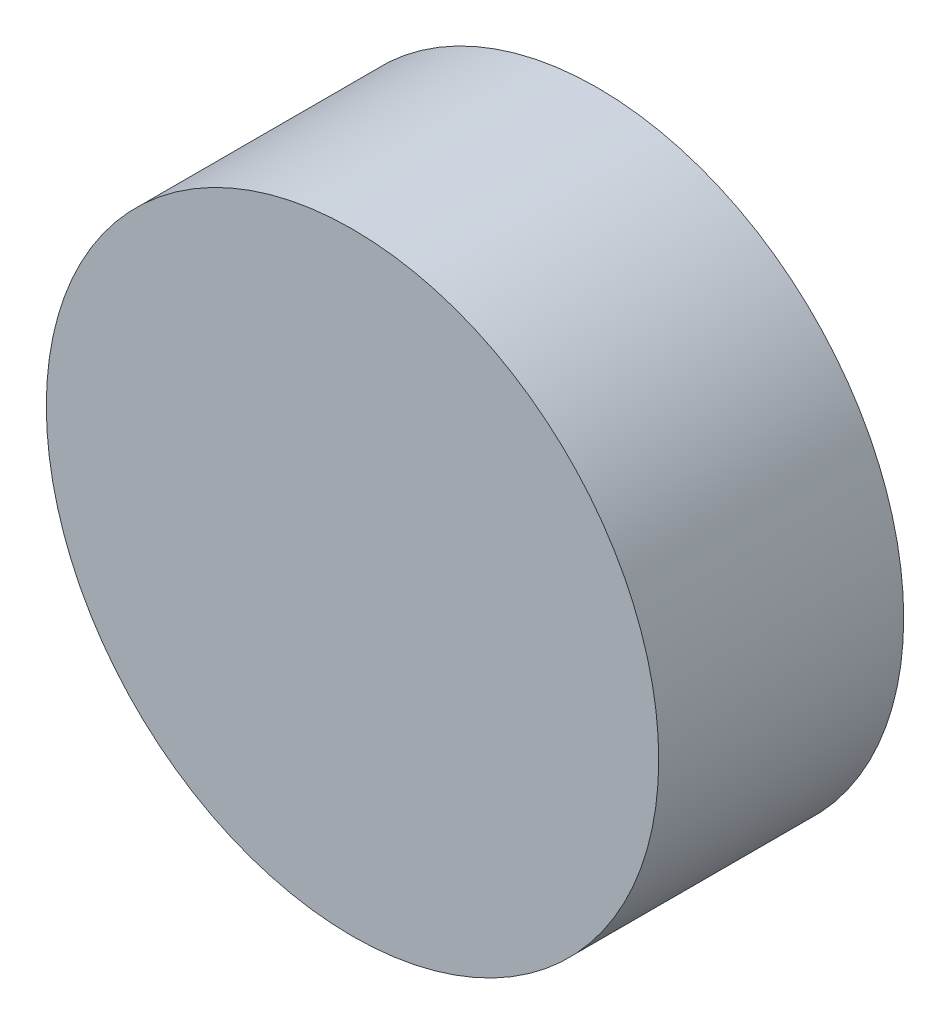
ISO-10303-21;
HEADER;
FILE_DESCRIPTION(('STEP AP214'),'2;1');
FILE_NAME('part.step','',(''),(''),'','','');
FILE_SCHEMA(('AUTOMOTIVE_DESIGN { 1 0 10303 214 1 1 1 1 }'));
ENDSEC;
DATA;
#1=APPLICATION_CONTEXT('core data for automotive mechanical design processes');
#2=APPLICATION_PROTOCOL_DEFINITION('international standard','automotive_design',2000,#1);
#3=PRODUCT_CONTEXT('',#1,'mechanical');
#4=PRODUCT('Part','Part','',(#3));
#5=PRODUCT_RELATED_PRODUCT_CATEGORY('part','',(#4));
#6=PRODUCT_DEFINITION_FORMATION('','',#4);
#7=PRODUCT_DEFINITION_CONTEXT('part definition',#1,'design');
#8=PRODUCT_DEFINITION('design','',#6,#7);
#9=PRODUCT_DEFINITION_SHAPE('','',#8);
#10=(LENGTH_UNIT() NAMED_UNIT(*) SI_UNIT(.MILLI.,.METRE.));
#11=(NAMED_UNIT(*) PLANE_ANGLE_UNIT() SI_UNIT($,.RADIAN.));
#12=(NAMED_UNIT(*) SI_UNIT($,.STERADIAN.) SOLID_ANGLE_UNIT());
#13=UNCERTAINTY_MEASURE_WITH_UNIT(LENGTH_MEASURE(1.E-05),#10,'distance_accuracy_value','');
#14=(GEOMETRIC_REPRESENTATION_CONTEXT(3) GLOBAL_UNCERTAINTY_ASSIGNED_CONTEXT((#13)) GLOBAL_UNIT_ASSIGNED_CONTEXT((#10,
#11,#12)) REPRESENTATION_CONTEXT('',''));
#15=CARTESIAN_POINT('',(0.,0.,0.));
#16=DIRECTION('',(0.,0.,1.));
#17=DIRECTION('',(1.,0.,0.));
#18=AXIS2_PLACEMENT_3D('',#15,#16,#17);
#19=CARTESIAN_POINT('',(0.,0.,40.));
#20=DIRECTION('',(0.,0.,-1.));
#21=DIRECTION('',(-1.,0.,0.));
#22=AXIS2_PLACEMENT_3D('',#19,#20,#21);
#23=CYLINDRICAL_SURFACE('',#22,50.);
#24=CARTESIAN_POINT('',(0.,0.,40.));
#25=DIRECTION('',(0.,0.,1.));
#26=DIRECTION('',(1.,0.,0.));
#27=AXIS2_PLACEMENT_3D('',#24,#25,#26);
#28=CIRCLE('',#27,50.);
#29=CARTESIAN_POINT('',(50.,0.,40.));
#30=VERTEX_POINT('',#29);
#31=EDGE_CURVE('E10',#30,#30,#28,.T.);
#32=ORIENTED_EDGE('',*,*,#31,.F.);
#33=EDGE_LOOP('',(#32));
#34=FACE_BOUND('',#33,.T.);
#35=CARTESIAN_POINT('',(0.,0.,0.));
#36=DIRECTION('',(0.,0.,1.));
#37=DIRECTION('',(1.,0.,0.));
#38=AXIS2_PLACEMENT_3D('',#35,#36,#37);
#39=CIRCLE('',#38,50.);
#40=CARTESIAN_POINT('',(50.,0.,0.));
#41=VERTEX_POINT('',#40);
#42=EDGE_CURVE('E34',#41,#41,#39,.T.);
#43=ORIENTED_EDGE('',*,*,#42,.T.);
#44=EDGE_LOOP('',(#43));
#45=FACE_BOUND('',#44,.T.);
#46=ADVANCED_FACE('F31',(#34,#45),#23,.T.);
#47=CARTESIAN_POINT('',(0.,0.,40.));
#48=DIRECTION('',(0.,0.,1.));
#49=DIRECTION('',(1.,0.,0.));
#50=AXIS2_PLACEMENT_3D('',#47,#48,#49);
#51=PLANE('',#50);
#52=ORIENTED_EDGE('',*,*,#31,.T.);
#53=EDGE_LOOP('',(#52));
#54=FACE_BOUND('',#53,.T.);
#55=ADVANCED_FACE('F83',(#54),#51,.T.);
#56=CARTESIAN_POINT('',(0.,0.,0.));
#57=DIRECTION('',(0.,0.,1.));
#58=DIRECTION('',(1.,0.,0.));
#59=AXIS2_PLACEMENT_3D('',#56,#57,#58);
#60=PLANE('',#59);
#61=CARTESIAN_POINT('',(0.,0.,0.));
#62=DIRECTION('',(0.,0.,-1.));
#63=DIRECTION('',(-1.,0.,0.));
#64=AXIS2_PLACEMENT_3D('',#61,#62,#63);
#65=CIRCLE('',#64,45.);
#66=CARTESIAN_POINT('',(-45.,0.,0.));
#67=VERTEX_POINT('',#66);
#68=EDGE_CURVE('E43',#67,#67,#65,.T.);
#69=ORIENTED_EDGE('',*,*,#68,.F.);
#70=EDGE_LOOP('',(#69));
#71=FACE_BOUND('',#70,.T.);
#72=ORIENTED_EDGE('',*,*,#42,.F.);
#73=EDGE_LOOP('',(#72));
#74=FACE_BOUND('',#73,.T.);
#75=ADVANCED_FACE('F88',(#71,#74),#60,.F.);
#76=CARTESIAN_POINT('',(0.,0.,1.5));
#77=DIRECTION('',(0.,0.,-1.));
#78=DIRECTION('',(-1.,0.,0.));
#79=AXIS2_PLACEMENT_3D('',#76,#77,#78);
#80=CYLINDRICAL_SURFACE('',#79,45.);
#81=CARTESIAN_POINT('',(0.,0.,1.5));
#82=DIRECTION('',(0.,0.,-1.));
#83=DIRECTION('',(-1.,0.,0.));
#84=AXIS2_PLACEMENT_3D('',#81,#82,#83);
#85=CIRCLE('',#84,45.);
#86=CARTESIAN_POINT('',(-45.,0.,1.5));
#87=VERTEX_POINT('',#86);
#88=EDGE_CURVE('E41',#87,#87,#85,.T.);
#89=ORIENTED_EDGE('',*,*,#88,.F.);
#90=EDGE_LOOP('',(#89));
#91=FACE_BOUND('',#90,.T.);
#92=ORIENTED_EDGE('',*,*,#68,.T.);
#93=EDGE_LOOP('',(#92));
#94=FACE_BOUND('',#93,.T.);
#95=ADVANCED_FACE('F94',(#91,#94),#80,.F.);
#96=CARTESIAN_POINT('',(0.,0.,1.5));
#97=DIRECTION('',(0.,0.,-1.));
#98=DIRECTION('',(-1.,0.,0.));
#99=AXIS2_PLACEMENT_3D('',#96,#97,#98);
#100=PLANE('',#99);
#101=CARTESIAN_POINT('',(0.,0.,1.5));
#102=DIRECTION('',(0.,0.,-1.));
#103=DIRECTION('',(-1.,0.,0.));
#104=AXIS2_PLACEMENT_3D('',#101,#102,#103);
#105=CIRCLE('',#104,32.5);
#106=CARTESIAN_POINT('',(-32.5,0.,1.5));
#107=VERTEX_POINT('',#106);
#108=EDGE_CURVE('E46',#107,#107,#105,.T.);
#109=ORIENTED_EDGE('',*,*,#108,.F.);
#110=EDGE_LOOP('',(#109));
#111=FACE_BOUND('',#110,.T.);
#112=ORIENTED_EDGE('',*,*,#88,.T.);
#113=EDGE_LOOP('',(#112));
#114=FACE_BOUND('',#113,.T.);
#115=ADVANCED_FACE('F100',(#111,#114),#100,.T.);
#116=CARTESIAN_POINT('',(0.,0.,1.5));
#117=DIRECTION('',(0.,0.,-1.));
#118=DIRECTION('',(-1.,0.,0.));
#119=AXIS2_PLACEMENT_3D('',#116,#117,#118);
#120=CYLINDRICAL_SURFACE('',#119,32.5);
#121=ORIENTED_EDGE('',*,*,#108,.T.);
#122=EDGE_LOOP('',(#121));
#123=FACE_BOUND('',#122,.T.);
#124=CARTESIAN_POINT('',(0.,0.,0.));
#125=DIRECTION('',(0.,0.,-1.));
#126=DIRECTION('',(-1.,0.,0.));
#127=AXIS2_PLACEMENT_3D('',#124,#125,#126);
#128=CIRCLE('',#127,32.5);
#129=CARTESIAN_POINT('',(-32.5,0.,0.));
#130=VERTEX_POINT('',#129);
#131=EDGE_CURVE('E49',#130,#130,#128,.T.);
#132=ORIENTED_EDGE('',*,*,#131,.F.);
#133=EDGE_LOOP('',(#132));
#134=FACE_BOUND('',#133,.T.);
#135=ADVANCED_FACE('F105',(#123,#134),#120,.T.);
#136=CARTESIAN_POINT('',(0.,0.,0.));
#137=DIRECTION('',(0.,0.,-1.));
#138=DIRECTION('',(-1.,0.,0.));
#139=AXIS2_PLACEMENT_3D('',#136,#137,#138);
#140=CIRCLE('',#139,13.);
#141=CARTESIAN_POINT('',(-13.,0.,0.));
#142=VERTEX_POINT('',#141);
#143=EDGE_CURVE('E55',#142,#142,#140,.T.);
#144=ORIENTED_EDGE('',*,*,#143,.F.);
#145=EDGE_LOOP('',(#144));
#146=FACE_BOUND('',#145,.T.);
#147=ORIENTED_EDGE('',*,*,#131,.T.);
#148=EDGE_LOOP('',(#147));
#149=FACE_BOUND('',#148,.T.);
#150=ADVANCED_FACE('F96',(#146,#149),#60,.F.);
#151=CARTESIAN_POINT('',(0.,0.,8.));
#152=DIRECTION('',(0.,0.,-1.));
#153=DIRECTION('',(-1.,0.,0.));
#154=AXIS2_PLACEMENT_3D('',#151,#152,#153);
#155=CYLINDRICAL_SURFACE('',#154,13.);
#156=CARTESIAN_POINT('',(0.,0.,8.));
#157=DIRECTION('',(0.,0.,-1.));
#158=DIRECTION('',(-1.,0.,0.));
#159=AXIS2_PLACEMENT_3D('',#156,#157,#158);
#160=CIRCLE('',#159,13.);
#161=CARTESIAN_POINT('',(-13.,0.,8.));
#162=VERTEX_POINT('',#161);
#163=EDGE_CURVE('E52',#162,#162,#160,.T.);
#164=ORIENTED_EDGE('',*,*,#163,.F.);
#165=EDGE_LOOP('',(#164));
#166=FACE_BOUND('',#165,.T.);
#167=ORIENTED_EDGE('',*,*,#143,.T.);
#168=EDGE_LOOP('',(#167));
#169=FACE_BOUND('',#168,.T.);
#170=ADVANCED_FACE('F79',(#166,#169),#155,.F.);
#171=CARTESIAN_POINT('',(0.,0.,8.));
#172=DIRECTION('',(0.,0.,-1.));
#173=DIRECTION('',(-1.,0.,0.));
#174=AXIS2_PLACEMENT_3D('',#171,#172,#173);
#175=PLANE('',#174);
#176=CARTESIAN_POINT('',(0.,0.,8.));
#177=DIRECTION('',(0.,0.,-1.));
#178=DIRECTION('',(-1.,0.,0.));
#179=AXIS2_PLACEMENT_3D('',#176,#177,#178);
#180=CIRCLE('',#179,5.00000000000002);
#181=CARTESIAN_POINT('',(-5.00000000000002,0.,8.));
#182=VERTEX_POINT('',#181);
#183=EDGE_CURVE('E58',#182,#182,#180,.T.);
#184=ORIENTED_EDGE('',*,*,#183,.F.);
#185=EDGE_LOOP('',(#184));
#186=FACE_BOUND('',#185,.T.);
#187=ORIENTED_EDGE('',*,*,#163,.T.);
#188=EDGE_LOOP('',(#187));
#189=FACE_BOUND('',#188,.T.);
#190=ADVANCED_FACE('F71',(#186,#189),#175,.T.);
#191=CARTESIAN_POINT('',(0.,0.,10.));
#192=DIRECTION('',(0.,0.,-1.));
#193=DIRECTION('',(-1.,0.,0.));
#194=AXIS2_PLACEMENT_3D('',#191,#192,#193);
#195=CYLINDRICAL_SURFACE('',#194,5.00000000000002);
#196=ORIENTED_EDGE('',*,*,#183,.T.);
#197=EDGE_LOOP('',(#196));
#198=FACE_BOUND('',#197,.T.);
#199=CARTESIAN_POINT('',(0.,0.,10.));
#200=DIRECTION('',(0.,0.,-1.));
#201=DIRECTION('',(-1.,0.,0.));
#202=AXIS2_PLACEMENT_3D('',#199,#200,#201);
#203=CIRCLE('',#202,5.00000000000002);
#204=CARTESIAN_POINT('',(-5.00000000000002,0.,10.));
#205=VERTEX_POINT('',#204);
#206=EDGE_CURVE('E63',#205,#205,#203,.T.);
#207=ORIENTED_EDGE('',*,*,#206,.F.);
#208=EDGE_LOOP('',(#207));
#209=FACE_BOUND('',#208,.T.);
#210=ADVANCED_FACE('F69',(#198,#209),#195,.F.);
#211=CARTESIAN_POINT('',(0.,0.,10.));
#212=DIRECTION('',(0.,0.,-1.));
#213=DIRECTION('',(-1.,0.,0.));
#214=AXIS2_PLACEMENT_3D('',#211,#212,#213);
#215=PLANE('',#214);
#216=ORIENTED_EDGE('',*,*,#206,.T.);
#217=EDGE_LOOP('',(#216));
#218=FACE_BOUND('',#217,.T.);
#219=ADVANCED_FACE('F67',(#218),#215,.T.);
#220=CLOSED_SHELL('',(#46,#55,#75,#95,#115,#135,#150,#170,#190,#210,#219));
#221=MANIFOLD_SOLID_BREP('B2',#220);
#222=ADVANCED_BREP_SHAPE_REPRESENTATION('',(#18,#221),#14);
#223=SHAPE_DEFINITION_REPRESENTATION(#9,#222);
ENDSEC;
END-ISO-10303-21;
